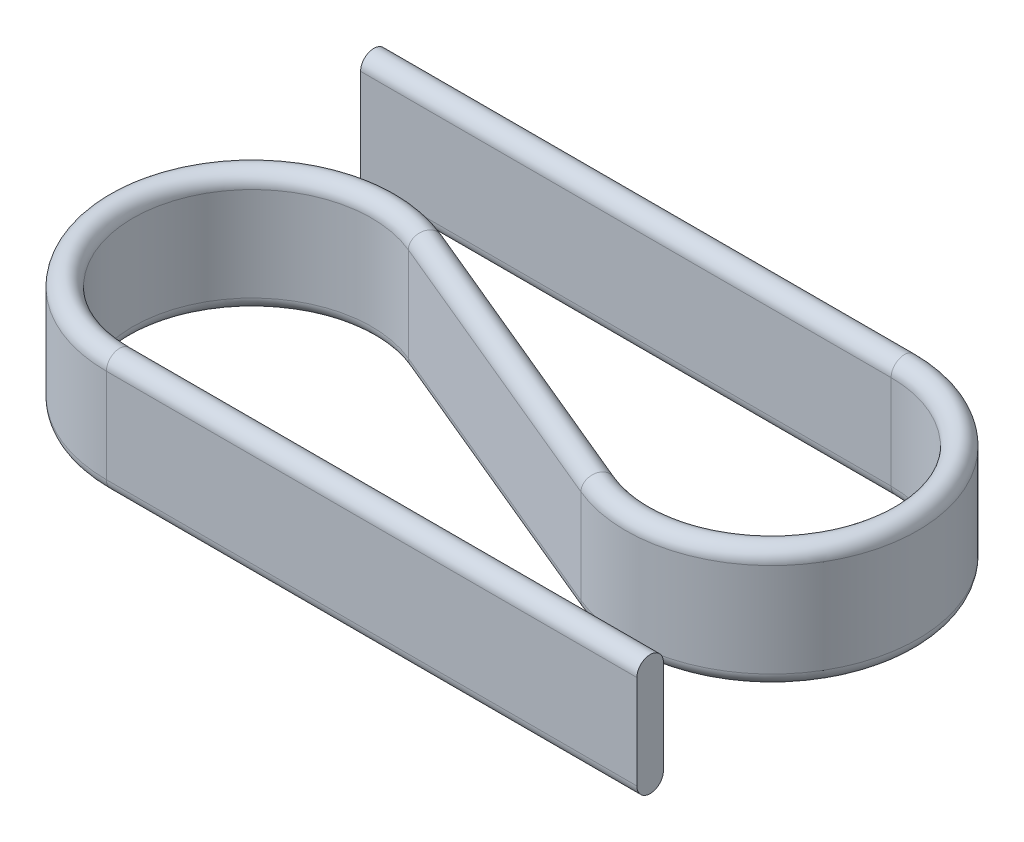
ISO-10303-21;
HEADER;
FILE_DESCRIPTION(('STEP AP214'),'2;1');
FILE_NAME('part.step','',(''),(''),'','','');
FILE_SCHEMA(('AUTOMOTIVE_DESIGN { 1 0 10303 214 1 1 1 1 }'));
ENDSEC;
DATA;
#1=APPLICATION_CONTEXT('core data for automotive mechanical design processes');
#2=APPLICATION_PROTOCOL_DEFINITION('international standard','automotive_design',2000,#1);
#3=PRODUCT_CONTEXT('',#1,'mechanical');
#4=PRODUCT('Part','Part','',(#3));
#5=PRODUCT_RELATED_PRODUCT_CATEGORY('part','',(#4));
#6=PRODUCT_DEFINITION_FORMATION('','',#4);
#7=PRODUCT_DEFINITION_CONTEXT('part definition',#1,'design');
#8=PRODUCT_DEFINITION('design','',#6,#7);
#9=PRODUCT_DEFINITION_SHAPE('','',#8);
#10=(LENGTH_UNIT() NAMED_UNIT(*) SI_UNIT(.MILLI.,.METRE.));
#11=(NAMED_UNIT(*) PLANE_ANGLE_UNIT() SI_UNIT($,.RADIAN.));
#12=(NAMED_UNIT(*) SI_UNIT($,.STERADIAN.) SOLID_ANGLE_UNIT());
#13=UNCERTAINTY_MEASURE_WITH_UNIT(LENGTH_MEASURE(1.E-05),#10,'distance_accuracy_value','');
#14=(GEOMETRIC_REPRESENTATION_CONTEXT(3) GLOBAL_UNCERTAINTY_ASSIGNED_CONTEXT((#13)) GLOBAL_UNIT_ASSIGNED_CONTEXT((#10,
#11,#12)) REPRESENTATION_CONTEXT('',''));
#15=CARTESIAN_POINT('',(0.,0.,0.));
#16=DIRECTION('',(0.,0.,1.));
#17=DIRECTION('',(1.,0.,0.));
#18=AXIS2_PLACEMENT_3D('',#15,#16,#17);
#19=CARTESIAN_POINT('',(0.,5.45,0.));
#20=DIRECTION('',(1.,0.,0.));
#21=DIRECTION('',(0.,0.,-1.));
#22=AXIS2_PLACEMENT_3D('',#19,#20,#21);
#23=CYLINDRICAL_SURFACE('',#22,1.2);
#24=CARTESIAN_POINT('',(48.,5.45,0.));
#25=DIRECTION('',(1.,0.,0.));
#26=DIRECTION('',(0.,0.,-1.));
#27=AXIS2_PLACEMENT_3D('',#24,#25,#26);
#28=CIRCLE('',#27,1.2);
#29=CARTESIAN_POINT('',(48.,5.45,-1.2));
#30=VERTEX_POINT('',#29);
#31=CARTESIAN_POINT('',(48.,5.45,1.2));
#32=VERTEX_POINT('',#31);
#33=EDGE_CURVE('E177',#30,#32,#28,.T.);
#34=ORIENTED_EDGE('',*,*,#33,.F.);
#35=DIRECTION('',(1.,0.,0.));
#36=VECTOR('',#35,1.);
#37=CARTESIAN_POINT('',(0.,5.45,-1.2));
#38=LINE('',#37,#36);
#39=CARTESIAN_POINT('',(0.,5.45,-1.2));
#40=VERTEX_POINT('',#39);
#41=EDGE_CURVE('E160',#40,#30,#38,.T.);
#42=ORIENTED_EDGE('',*,*,#41,.F.);
#43=CARTESIAN_POINT('',(0.,5.45,0.));
#44=DIRECTION('',(1.,0.,0.));
#45=DIRECTION('',(0.,0.,-1.));
#46=AXIS2_PLACEMENT_3D('',#43,#44,#45);
#47=CIRCLE('',#46,1.2);
#48=CARTESIAN_POINT('',(0.,5.45,1.2));
#49=VERTEX_POINT('',#48);
#50=EDGE_CURVE('E144',#40,#49,#47,.T.);
#51=ORIENTED_EDGE('',*,*,#50,.T.);
#52=DIRECTION('',(1.,0.,0.));
#53=VECTOR('',#52,1.);
#54=CARTESIAN_POINT('',(0.,5.45,1.2));
#55=LINE('',#54,#53);
#56=EDGE_CURVE('E158',#49,#32,#55,.T.);
#57=ORIENTED_EDGE('',*,*,#56,.T.);
#58=EDGE_LOOP('',(#34,#42,#51,#57));
#59=FACE_BOUND('',#58,.T.);
#60=ADVANCED_FACE('F34',(#59),#23,.T.);
#61=CARTESIAN_POINT('',(48.,5.45,12.));
#62=DIRECTION('',(0.,-1.,0.));
#63=DIRECTION('',(0.,0.,-1.));
#64=AXIS2_PLACEMENT_3D('',#61,#62,#63);
#65=TOROIDAL_SURFACE('',#64,12.,1.2);
#66=CARTESIAN_POINT('',(43.3846153846152,5.45,23.076923076923));
#67=DIRECTION('',(-0.923076923076918,0.,-0.384615384615398));
#68=DIRECTION('',(-0.384615384615398,0.,0.923076923076918));
#69=AXIS2_PLACEMENT_3D('',#66,#67,#68);
#70=CIRCLE('',#69,1.2);
#71=CARTESIAN_POINT('',(42.9230769230768,5.45,24.1846153846153));
#72=VERTEX_POINT('',#71);
#73=CARTESIAN_POINT('',(43.8461538461537,5.45,21.9692307692307));
#74=VERTEX_POINT('',#73);
#75=EDGE_CURVE('E185',#72,#74,#70,.T.);
#76=ORIENTED_EDGE('',*,*,#75,.F.);
#77=CARTESIAN_POINT('',(48.,5.45,12.));
#78=DIRECTION('',(0.,-1.,0.));
#79=DIRECTION('',(0.,0.,-1.));
#80=AXIS2_PLACEMENT_3D('',#77,#78,#79);
#81=CIRCLE('',#80,13.2);
#82=EDGE_CURVE('E211',#30,#72,#81,.T.);
#83=ORIENTED_EDGE('',*,*,#82,.F.);
#84=ORIENTED_EDGE('',*,*,#33,.T.);
#85=CARTESIAN_POINT('',(48.,5.45,12.));
#86=DIRECTION('',(0.,-1.,0.));
#87=DIRECTION('',(0.,0.,-1.));
#88=AXIS2_PLACEMENT_3D('',#85,#86,#87);
#89=CIRCLE('',#88,10.8);
#90=EDGE_CURVE('E174',#32,#74,#89,.T.);
#91=ORIENTED_EDGE('',*,*,#90,.T.);
#92=EDGE_LOOP('',(#76,#83,#84,#91));
#93=FACE_BOUND('',#92,.T.);
#94=ADVANCED_FACE('F284',(#93),#65,.T.);
#95=CARTESIAN_POINT('',(43.3846153846152,5.45,23.076923076923));
#96=DIRECTION('',(-0.923076923076918,0.,-0.384615384615397));
#97=DIRECTION('',(-0.384615384615397,0.,0.923076923076918));
#98=AXIS2_PLACEMENT_3D('',#95,#96,#97);
#99=CYLINDRICAL_SURFACE('',#98,1.2);
#100=CARTESIAN_POINT('',(16.6153846153846,5.45,11.9230769230765));
#101=DIRECTION('',(-0.923076923076918,0.,-0.384615384615397));
#102=DIRECTION('',(-0.384615384615397,0.,0.923076923076918));
#103=AXIS2_PLACEMENT_3D('',#100,#101,#102);
#104=CIRCLE('',#103,1.2);
#105=CARTESIAN_POINT('',(16.1538461538461,5.45,13.0307692307688));
#106=VERTEX_POINT('',#105);
#107=CARTESIAN_POINT('',(17.0769230769231,5.45,10.8153846153842));
#108=VERTEX_POINT('',#107);
#109=EDGE_CURVE('E192',#106,#108,#104,.T.);
#110=ORIENTED_EDGE('',*,*,#109,.F.);
#111=DIRECTION('',(-0.923076923076918,0.,-0.384615384615397));
#112=VECTOR('',#111,1.);
#113=CARTESIAN_POINT('',(42.9230769230767,5.45,24.1846153846153));
#114=LINE('',#113,#112);
#115=EDGE_CURVE('E217',#72,#106,#114,.T.);
#116=ORIENTED_EDGE('',*,*,#115,.F.);
#117=ORIENTED_EDGE('',*,*,#75,.T.);
#118=DIRECTION('',(-0.923076923076918,0.,-0.384615384615397));
#119=VECTOR('',#118,1.);
#120=CARTESIAN_POINT('',(43.8461538461537,5.45,21.9692307692307));
#121=LINE('',#120,#119);
#122=EDGE_CURVE('E182',#74,#108,#121,.T.);
#123=ORIENTED_EDGE('',*,*,#122,.T.);
#124=EDGE_LOOP('',(#110,#116,#117,#123));
#125=FACE_BOUND('',#124,.T.);
#126=ADVANCED_FACE('F305',(#125),#99,.T.);
#127=CARTESIAN_POINT('',(12.0000000000003,5.45,22.9999999999984));
#128=DIRECTION('',(0.,1.,0.));
#129=DIRECTION('',(0.,0.,1.));
#130=AXIS2_PLACEMENT_3D('',#127,#128,#129);
#131=TOROIDAL_SURFACE('',#130,11.9999999999988,1.2);
#132=CARTESIAN_POINT('',(12.0000000000003,5.45,34.9999999999971));
#133=DIRECTION('',(1.,0.,0.));
#134=DIRECTION('',(0.,0.,-1.));
#135=AXIS2_PLACEMENT_3D('',#132,#133,#134);
#136=CIRCLE('',#135,1.2);
#137=CARTESIAN_POINT('',(12.0000000000003,5.45,33.7999999999971));
#138=VERTEX_POINT('',#137);
#139=CARTESIAN_POINT('',(12.0000000000003,5.45,36.1999999999971));
#140=VERTEX_POINT('',#139);
#141=EDGE_CURVE('E199',#138,#140,#136,.T.);
#142=ORIENTED_EDGE('',*,*,#141,.F.);
#143=CARTESIAN_POINT('',(12.0000000000003,5.45,22.9999999999984));
#144=DIRECTION('',(0.,1.,0.));
#145=DIRECTION('',(0.384615384615397,0.,-0.923076923076918));
#146=AXIS2_PLACEMENT_3D('',#143,#144,#145);
#147=CIRCLE('',#146,10.7999999999988);
#148=EDGE_CURVE('E223',#106,#138,#147,.T.);
#149=ORIENTED_EDGE('',*,*,#148,.F.);
#150=ORIENTED_EDGE('',*,*,#109,.T.);
#151=CARTESIAN_POINT('',(12.0000000000003,5.45,22.9999999999984));
#152=DIRECTION('',(0.,1.,0.));
#153=DIRECTION('',(0.384615384615397,0.,-0.923076923076918));
#154=AXIS2_PLACEMENT_3D('',#151,#152,#153);
#155=CIRCLE('',#154,13.1999999999988);
#156=EDGE_CURVE('E189',#108,#140,#155,.T.);
#157=ORIENTED_EDGE('',*,*,#156,.T.);
#158=EDGE_LOOP('',(#142,#149,#150,#157));
#159=FACE_BOUND('',#158,.T.);
#160=ADVANCED_FACE('F302',(#159),#131,.T.);
#161=CARTESIAN_POINT('',(12.0000000000003,5.45,34.9999999999971));
#162=DIRECTION('',(1.,0.,0.));
#163=DIRECTION('',(0.,0.,-1.));
#164=AXIS2_PLACEMENT_3D('',#161,#162,#163);
#165=CYLINDRICAL_SURFACE('',#164,1.2);
#166=CARTESIAN_POINT('',(60.,5.45,34.9999999999971));
#167=DIRECTION('',(1.,0.,0.));
#168=DIRECTION('',(0.,0.,-1.));
#169=AXIS2_PLACEMENT_3D('',#166,#167,#168);
#170=CIRCLE('',#169,1.2);
#171=CARTESIAN_POINT('',(60.,5.45,33.7999999999971));
#172=VERTEX_POINT('',#171);
#173=CARTESIAN_POINT('',(60.,5.45,36.1999999999971));
#174=VERTEX_POINT('',#173);
#175=EDGE_CURVE('E234',#172,#174,#170,.T.);
#176=ORIENTED_EDGE('',*,*,#175,.F.);
#177=DIRECTION('',(1.,0.,0.));
#178=VECTOR('',#177,1.);
#179=CARTESIAN_POINT('',(12.0000000000003,5.45,33.7999999999971));
#180=LINE('',#179,#178);
#181=EDGE_CURVE('E228',#138,#172,#180,.T.);
#182=ORIENTED_EDGE('',*,*,#181,.F.);
#183=ORIENTED_EDGE('',*,*,#141,.T.);
#184=DIRECTION('',(1.,0.,0.));
#185=VECTOR('',#184,1.);
#186=CARTESIAN_POINT('',(12.0000000000003,5.45,36.1999999999971));
#187=LINE('',#186,#185);
#188=EDGE_CURVE('E196',#140,#174,#187,.T.);
#189=ORIENTED_EDGE('',*,*,#188,.T.);
#190=EDGE_LOOP('',(#176,#182,#183,#189));
#191=FACE_BOUND('',#190,.T.);
#192=ADVANCED_FACE('F299',(#191),#165,.T.);
#193=CARTESIAN_POINT('',(12.0000000000003,0.,33.8));
#194=DIRECTION('',(0.,0.,-1.));
#195=DIRECTION('',(0.,-1.,0.));
#196=AXIS2_PLACEMENT_3D('',#193,#194,#195);
#197=PLANE('',#196);
#198=DIRECTION('',(0.,1.,0.));
#199=VECTOR('',#198,1.);
#200=CARTESIAN_POINT('',(12.0000000000003,0.,33.8));
#201=LINE('',#200,#199);
#202=CARTESIAN_POINT('',(12.0000000000003,-3.05,33.7999999999971));
#203=VERTEX_POINT('',#202);
#204=EDGE_CURVE('E11',#203,#138,#201,.T.);
#205=ORIENTED_EDGE('',*,*,#204,.T.);
#206=ORIENTED_EDGE('',*,*,#181,.T.);
#207=DIRECTION('',(0.,1.,0.));
#208=VECTOR('',#207,1.);
#209=CARTESIAN_POINT('',(60.,0.,33.8));
#210=LINE('',#209,#208);
#211=CARTESIAN_POINT('',(60.,-3.05,33.7999999999971));
#212=VERTEX_POINT('',#211);
#213=EDGE_CURVE('E52',#212,#172,#210,.T.);
#214=ORIENTED_EDGE('',*,*,#213,.F.);
#215=DIRECTION('',(1.,0.,0.));
#216=VECTOR('',#215,1.);
#217=CARTESIAN_POINT('',(12.0000000000003,-3.05,33.7999999999971));
#218=LINE('',#217,#216);
#219=EDGE_CURVE('E225',#203,#212,#218,.T.);
#220=ORIENTED_EDGE('',*,*,#219,.F.);
#221=EDGE_LOOP('',(#205,#206,#214,#220));
#222=FACE_BOUND('',#221,.T.);
#223=ADVANCED_FACE('F318',(#222),#197,.T.);
#224=CARTESIAN_POINT('',(12.0000000000003,0.,36.2));
#225=DIRECTION('',(0.,0.,1.));
#226=DIRECTION('',(1.,0.,0.));
#227=AXIS2_PLACEMENT_3D('',#224,#225,#226);
#228=PLANE('',#227);
#229=DIRECTION('',(0.,-1.,0.));
#230=VECTOR('',#229,1.);
#231=CARTESIAN_POINT('',(12.0000000000003,0.,36.2));
#232=LINE('',#231,#230);
#233=CARTESIAN_POINT('',(12.0000000000003,-3.05,36.1999999999971));
#234=VERTEX_POINT('',#233);
#235=EDGE_CURVE('E44',#140,#234,#232,.T.);
#236=ORIENTED_EDGE('',*,*,#235,.T.);
#237=DIRECTION('',(1.,0.,0.));
#238=VECTOR('',#237,1.);
#239=CARTESIAN_POINT('',(12.0000000000003,-3.05,36.1999999999971));
#240=LINE('',#239,#238);
#241=CARTESIAN_POINT('',(60.,-3.05,36.1999999999971));
#242=VERTEX_POINT('',#241);
#243=EDGE_CURVE('E193',#234,#242,#240,.T.);
#244=ORIENTED_EDGE('',*,*,#243,.T.);
#245=DIRECTION('',(0.,-1.,0.));
#246=VECTOR('',#245,1.);
#247=CARTESIAN_POINT('',(60.,0.,36.2));
#248=LINE('',#247,#246);
#249=EDGE_CURVE('E245',#174,#242,#248,.T.);
#250=ORIENTED_EDGE('',*,*,#249,.F.);
#251=ORIENTED_EDGE('',*,*,#188,.F.);
#252=EDGE_LOOP('',(#236,#244,#250,#251));
#253=FACE_BOUND('',#252,.T.);
#254=ADVANCED_FACE('F296',(#253),#228,.T.);
#255=CARTESIAN_POINT('',(12.,0.,23.));
#256=DIRECTION('',(0.,1.,0.));
#257=DIRECTION('',(0.,0.,1.));
#258=AXIS2_PLACEMENT_3D('',#255,#256,#257);
#259=CYLINDRICAL_SURFACE('',#258,10.8);
#260=DIRECTION('',(0.,1.,0.));
#261=VECTOR('',#260,1.);
#262=CARTESIAN_POINT('',(16.153846153846,0.,13.0307692307691));
#263=LINE('',#262,#261);
#264=CARTESIAN_POINT('',(16.1538461538461,-3.05,13.0307692307688));
#265=VERTEX_POINT('',#264);
#266=EDGE_CURVE('E38',#265,#106,#263,.T.);
#267=ORIENTED_EDGE('',*,*,#266,.T.);
#268=ORIENTED_EDGE('',*,*,#148,.T.);
#269=ORIENTED_EDGE('',*,*,#204,.F.);
#270=CARTESIAN_POINT('',(12.0000000000003,-3.05,22.9999999999984));
#271=DIRECTION('',(0.,1.,0.));
#272=DIRECTION('',(0.384615384615397,0.,-0.923076923076918));
#273=AXIS2_PLACEMENT_3D('',#270,#271,#272);
#274=CIRCLE('',#273,10.7999999999988);
#275=EDGE_CURVE('E220',#265,#203,#274,.T.);
#276=ORIENTED_EDGE('',*,*,#275,.F.);
#277=EDGE_LOOP('',(#267,#268,#269,#276));
#278=FACE_BOUND('',#277,.T.);
#279=ADVANCED_FACE('F333',(#278),#259,.F.);
#280=CARTESIAN_POINT('',(12.,0.,23.));
#281=DIRECTION('',(0.,1.,0.));
#282=DIRECTION('',(0.,0.,1.));
#283=AXIS2_PLACEMENT_3D('',#280,#281,#282);
#284=CYLINDRICAL_SURFACE('',#283,13.2);
#285=DIRECTION('',(0.,-1.,0.));
#286=VECTOR('',#285,1.);
#287=CARTESIAN_POINT('',(17.0769230769229,0.,10.8153846153845));
#288=LINE('',#287,#286);
#289=CARTESIAN_POINT('',(17.0769230769231,-3.05,10.8153846153842));
#290=VERTEX_POINT('',#289);
#291=EDGE_CURVE('E122',#108,#290,#288,.T.);
#292=ORIENTED_EDGE('',*,*,#291,.T.);
#293=CARTESIAN_POINT('',(12.0000000000003,-3.05,22.9999999999984));
#294=DIRECTION('',(0.,1.,0.));
#295=DIRECTION('',(0.384615384615397,0.,-0.923076923076918));
#296=AXIS2_PLACEMENT_3D('',#293,#294,#295);
#297=CIRCLE('',#296,13.1999999999988);
#298=EDGE_CURVE('E186',#290,#234,#297,.T.);
#299=ORIENTED_EDGE('',*,*,#298,.T.);
#300=ORIENTED_EDGE('',*,*,#235,.F.);
#301=ORIENTED_EDGE('',*,*,#156,.F.);
#302=EDGE_LOOP('',(#292,#299,#300,#301));
#303=FACE_BOUND('',#302,.T.);
#304=ADVANCED_FACE('F295',(#303),#284,.T.);
#305=CARTESIAN_POINT('',(42.9230769230767,0.,24.1846153846153));
#306=DIRECTION('',(-0.384615384615385,0.,0.923076923076923));
#307=DIRECTION('',(0.,1.,0.));
#308=AXIS2_PLACEMENT_3D('',#305,#306,#307);
#309=PLANE('',#308);
#310=DIRECTION('',(0.,1.,0.));
#311=VECTOR('',#310,1.);
#312=CARTESIAN_POINT('',(42.9230769230767,0.,24.1846153846153));
#313=LINE('',#312,#311);
#314=CARTESIAN_POINT('',(42.9230769230768,-3.05,24.1846153846153));
#315=VERTEX_POINT('',#314);
#316=EDGE_CURVE('E253',#315,#72,#313,.T.);
#317=ORIENTED_EDGE('',*,*,#316,.T.);
#318=ORIENTED_EDGE('',*,*,#115,.T.);
#319=ORIENTED_EDGE('',*,*,#266,.F.);
#320=DIRECTION('',(-0.923076923076918,0.,-0.384615384615397));
#321=VECTOR('',#320,1.);
#322=CARTESIAN_POINT('',(42.9230769230767,-3.05,24.1846153846153));
#323=LINE('',#322,#321);
#324=EDGE_CURVE('E214',#315,#265,#323,.T.);
#325=ORIENTED_EDGE('',*,*,#324,.F.);
#326=EDGE_LOOP('',(#317,#318,#319,#325));
#327=FACE_BOUND('',#326,.T.);
#328=ADVANCED_FACE('F287',(#327),#309,.T.);
#329=CARTESIAN_POINT('',(43.8461538461537,0.,21.9692307692307));
#330=DIRECTION('',(0.384615384615385,0.,-0.923076923076923));
#331=DIRECTION('',(0.,-1.,0.));
#332=AXIS2_PLACEMENT_3D('',#329,#330,#331);
#333=PLANE('',#332);
#334=DIRECTION('',(0.,-1.,0.));
#335=VECTOR('',#334,1.);
#336=CARTESIAN_POINT('',(43.8461538461537,0.,21.9692307692307));
#337=LINE('',#336,#335);
#338=CARTESIAN_POINT('',(43.8461538461537,-3.05,21.9692307692307));
#339=VERTEX_POINT('',#338);
#340=EDGE_CURVE('E256',#74,#339,#337,.T.);
#341=ORIENTED_EDGE('',*,*,#340,.T.);
#342=DIRECTION('',(-0.923076923076918,0.,-0.384615384615397));
#343=VECTOR('',#342,1.);
#344=CARTESIAN_POINT('',(43.8461538461537,-3.05,21.9692307692307));
#345=LINE('',#344,#343);
#346=EDGE_CURVE('E178',#339,#290,#345,.T.);
#347=ORIENTED_EDGE('',*,*,#346,.T.);
#348=ORIENTED_EDGE('',*,*,#291,.F.);
#349=ORIENTED_EDGE('',*,*,#122,.F.);
#350=EDGE_LOOP('',(#341,#347,#348,#349));
#351=FACE_BOUND('',#350,.T.);
#352=ADVANCED_FACE('F307',(#351),#333,.T.);
#353=CARTESIAN_POINT('',(48.,0.,12.));
#354=DIRECTION('',(0.,-1.,0.));
#355=DIRECTION('',(0.,0.,-1.));
#356=AXIS2_PLACEMENT_3D('',#353,#354,#355);
#357=CYLINDRICAL_SURFACE('',#356,13.2);
#358=DIRECTION('',(0.,1.,0.));
#359=VECTOR('',#358,1.);
#360=CARTESIAN_POINT('',(48.,0.,-1.2));
#361=LINE('',#360,#359);
#362=CARTESIAN_POINT('',(48.,-3.05,-1.2));
#363=VERTEX_POINT('',#362);
#364=EDGE_CURVE('E250',#363,#30,#361,.T.);
#365=ORIENTED_EDGE('',*,*,#364,.T.);
#366=ORIENTED_EDGE('',*,*,#82,.T.);
#367=ORIENTED_EDGE('',*,*,#316,.F.);
#368=CARTESIAN_POINT('',(48.,-3.05,12.));
#369=DIRECTION('',(0.,-1.,0.));
#370=DIRECTION('',(0.,0.,-1.));
#371=AXIS2_PLACEMENT_3D('',#368,#369,#370);
#372=CIRCLE('',#371,13.2);
#373=EDGE_CURVE('E208',#363,#315,#372,.T.);
#374=ORIENTED_EDGE('',*,*,#373,.F.);
#375=EDGE_LOOP('',(#365,#366,#367,#374));
#376=FACE_BOUND('',#375,.T.);
#377=ADVANCED_FACE('F36',(#376),#357,.T.);
#378=CARTESIAN_POINT('',(48.,0.,12.));
#379=DIRECTION('',(0.,-1.,0.));
#380=DIRECTION('',(0.,0.,-1.));
#381=AXIS2_PLACEMENT_3D('',#378,#379,#380);
#382=CYLINDRICAL_SURFACE('',#381,10.8);
#383=DIRECTION('',(0.,-1.,0.));
#384=VECTOR('',#383,1.);
#385=CARTESIAN_POINT('',(48.,0.,1.2));
#386=LINE('',#385,#384);
#387=CARTESIAN_POINT('',(48.,-3.05,1.2));
#388=VERTEX_POINT('',#387);
#389=EDGE_CURVE('E163',#32,#388,#386,.T.);
#390=ORIENTED_EDGE('',*,*,#389,.T.);
#391=CARTESIAN_POINT('',(48.,-3.05,12.));
#392=DIRECTION('',(0.,-1.,0.));
#393=DIRECTION('',(0.,0.,-1.));
#394=AXIS2_PLACEMENT_3D('',#391,#392,#393);
#395=CIRCLE('',#394,10.8);
#396=EDGE_CURVE('E170',#388,#339,#395,.T.);
#397=ORIENTED_EDGE('',*,*,#396,.T.);
#398=ORIENTED_EDGE('',*,*,#340,.F.);
#399=ORIENTED_EDGE('',*,*,#90,.F.);
#400=EDGE_LOOP('',(#390,#397,#398,#399));
#401=FACE_BOUND('',#400,.T.);
#402=ADVANCED_FACE('F279',(#401),#382,.F.);
#403=CARTESIAN_POINT('',(48.,0.,-1.2));
#404=DIRECTION('',(0.,0.,1.));
#405=DIRECTION('',(1.,0.,0.));
#406=AXIS2_PLACEMENT_3D('',#403,#404,#405);
#407=PLANE('',#406);
#408=DIRECTION('',(0.,1.,0.));
#409=VECTOR('',#408,1.);
#410=CARTESIAN_POINT('',(0.,0.,-1.2));
#411=LINE('',#410,#409);
#412=CARTESIAN_POINT('',(0.,-3.05,-1.2));
#413=VERTEX_POINT('',#412);
#414=EDGE_CURVE('E153',#413,#40,#411,.T.);
#415=ORIENTED_EDGE('',*,*,#414,.T.);
#416=ORIENTED_EDGE('',*,*,#41,.T.);
#417=ORIENTED_EDGE('',*,*,#364,.F.);
#418=DIRECTION('',(1.,0.,0.));
#419=VECTOR('',#418,1.);
#420=CARTESIAN_POINT('',(0.,-3.05,-1.2));
#421=LINE('',#420,#419);
#422=EDGE_CURVE('E203',#413,#363,#421,.T.);
#423=ORIENTED_EDGE('',*,*,#422,.F.);
#424=EDGE_LOOP('',(#415,#416,#417,#423));
#425=FACE_BOUND('',#424,.T.);
#426=ADVANCED_FACE('F269',(#425),#407,.F.);
#427=CARTESIAN_POINT('',(48.,0.,1.2));
#428=DIRECTION('',(0.,0.,-1.));
#429=DIRECTION('',(0.,-1.,0.));
#430=AXIS2_PLACEMENT_3D('',#427,#428,#429);
#431=PLANE('',#430);
#432=DIRECTION('',(0.,-1.,0.));
#433=VECTOR('',#432,1.);
#434=CARTESIAN_POINT('',(0.,0.,1.2));
#435=LINE('',#434,#433);
#436=CARTESIAN_POINT('',(0.,-3.05,1.2));
#437=VERTEX_POINT('',#436);
#438=EDGE_CURVE('E141',#49,#437,#435,.T.);
#439=ORIENTED_EDGE('',*,*,#438,.T.);
#440=DIRECTION('',(1.,0.,0.));
#441=VECTOR('',#440,1.);
#442=CARTESIAN_POINT('',(0.,-3.05,1.2));
#443=LINE('',#442,#441);
#444=EDGE_CURVE('E165',#437,#388,#443,.T.);
#445=ORIENTED_EDGE('',*,*,#444,.T.);
#446=ORIENTED_EDGE('',*,*,#389,.F.);
#447=ORIENTED_EDGE('',*,*,#56,.F.);
#448=EDGE_LOOP('',(#439,#445,#446,#447));
#449=FACE_BOUND('',#448,.T.);
#450=ADVANCED_FACE('F162',(#449),#431,.F.);
#451=CARTESIAN_POINT('',(60.,0.,35.));
#452=DIRECTION('',(1.,0.,0.));
#453=DIRECTION('',(0.,0.,1.));
#454=AXIS2_PLACEMENT_3D('',#451,#452,#453);
#455=PLANE('',#454);
#456=ORIENTED_EDGE('',*,*,#249,.T.);
#457=CARTESIAN_POINT('',(60.,-3.05,34.9999999999971));
#458=DIRECTION('',(1.,0.,0.));
#459=DIRECTION('',(0.,0.,-1.));
#460=AXIS2_PLACEMENT_3D('',#457,#458,#459);
#461=CIRCLE('',#460,1.2);
#462=EDGE_CURVE('E195',#242,#212,#461,.T.);
#463=ORIENTED_EDGE('',*,*,#462,.T.);
#464=ORIENTED_EDGE('',*,*,#213,.T.);
#465=ORIENTED_EDGE('',*,*,#175,.T.);
#466=EDGE_LOOP('',(#456,#463,#464,#465));
#467=FACE_BOUND('',#466,.T.);
#468=ADVANCED_FACE('F330',(#467),#455,.T.);
#469=CARTESIAN_POINT('',(0.,0.,0.));
#470=DIRECTION('',(1.,0.,0.));
#471=DIRECTION('',(0.,1.,0.));
#472=AXIS2_PLACEMENT_3D('',#469,#470,#471);
#473=PLANE('',#472);
#474=ORIENTED_EDGE('',*,*,#414,.F.);
#475=CARTESIAN_POINT('',(0.,-3.05,0.));
#476=DIRECTION('',(1.,0.,0.));
#477=DIRECTION('',(0.,0.,-1.));
#478=AXIS2_PLACEMENT_3D('',#475,#476,#477);
#479=CIRCLE('',#478,1.2);
#480=EDGE_CURVE('E147',#437,#413,#479,.T.);
#481=ORIENTED_EDGE('',*,*,#480,.F.);
#482=ORIENTED_EDGE('',*,*,#438,.F.);
#483=ORIENTED_EDGE('',*,*,#50,.F.);
#484=EDGE_LOOP('',(#474,#481,#482,#483));
#485=FACE_BOUND('',#484,.T.);
#486=ADVANCED_FACE('F143',(#485),#473,.F.);
#487=CARTESIAN_POINT('',(12.0000000000003,-3.05,34.9999999999971));
#488=DIRECTION('',(1.,0.,0.));
#489=DIRECTION('',(0.,0.,-1.));
#490=AXIS2_PLACEMENT_3D('',#487,#488,#489);
#491=CYLINDRICAL_SURFACE('',#490,1.2);
#492=ORIENTED_EDGE('',*,*,#219,.T.);
#493=ORIENTED_EDGE('',*,*,#462,.F.);
#494=ORIENTED_EDGE('',*,*,#243,.F.);
#495=CARTESIAN_POINT('',(12.0000000000003,-3.05,34.9999999999971));
#496=DIRECTION('',(1.,0.,0.));
#497=DIRECTION('',(0.,0.,-1.));
#498=AXIS2_PLACEMENT_3D('',#495,#496,#497);
#499=CIRCLE('',#498,1.2);
#500=EDGE_CURVE('E188',#234,#203,#499,.T.);
#501=ORIENTED_EDGE('',*,*,#500,.T.);
#502=EDGE_LOOP('',(#492,#493,#494,#501));
#503=FACE_BOUND('',#502,.T.);
#504=ADVANCED_FACE('F335',(#503),#491,.T.);
#505=CARTESIAN_POINT('',(12.0000000000003,-3.05,22.9999999999984));
#506=DIRECTION('',(0.,1.,0.));
#507=DIRECTION('',(0.,0.,1.));
#508=AXIS2_PLACEMENT_3D('',#505,#506,#507);
#509=TOROIDAL_SURFACE('',#508,11.9999999999988,1.2);
#510=ORIENTED_EDGE('',*,*,#275,.T.);
#511=ORIENTED_EDGE('',*,*,#500,.F.);
#512=ORIENTED_EDGE('',*,*,#298,.F.);
#513=CARTESIAN_POINT('',(16.6153846153846,-3.05,11.9230769230765));
#514=DIRECTION('',(-0.923076923076918,0.,-0.384615384615397));
#515=DIRECTION('',(-0.384615384615397,0.,0.923076923076918));
#516=AXIS2_PLACEMENT_3D('',#513,#514,#515);
#517=CIRCLE('',#516,1.2);
#518=EDGE_CURVE('E181',#290,#265,#517,.T.);
#519=ORIENTED_EDGE('',*,*,#518,.T.);
#520=EDGE_LOOP('',(#510,#511,#512,#519));
#521=FACE_BOUND('',#520,.T.);
#522=ADVANCED_FACE('F293',(#521),#509,.T.);
#523=CARTESIAN_POINT('',(43.3846153846152,-3.05,23.076923076923));
#524=DIRECTION('',(-0.923076923076918,0.,-0.384615384615397));
#525=DIRECTION('',(-0.384615384615397,0.,0.923076923076918));
#526=AXIS2_PLACEMENT_3D('',#523,#524,#525);
#527=CYLINDRICAL_SURFACE('',#526,1.2);
#528=ORIENTED_EDGE('',*,*,#324,.T.);
#529=ORIENTED_EDGE('',*,*,#518,.F.);
#530=ORIENTED_EDGE('',*,*,#346,.F.);
#531=CARTESIAN_POINT('',(43.3846153846152,-3.05,23.076923076923));
#532=DIRECTION('',(-0.923076923076918,0.,-0.384615384615398));
#533=DIRECTION('',(-0.384615384615398,0.,0.923076923076918));
#534=AXIS2_PLACEMENT_3D('',#531,#532,#533);
#535=CIRCLE('',#534,1.2);
#536=EDGE_CURVE('E173',#339,#315,#535,.T.);
#537=ORIENTED_EDGE('',*,*,#536,.T.);
#538=EDGE_LOOP('',(#528,#529,#530,#537));
#539=FACE_BOUND('',#538,.T.);
#540=ADVANCED_FACE('F290',(#539),#527,.T.);
#541=CARTESIAN_POINT('',(48.,-3.05,12.));
#542=DIRECTION('',(0.,-1.,0.));
#543=DIRECTION('',(0.,0.,-1.));
#544=AXIS2_PLACEMENT_3D('',#541,#542,#543);
#545=TOROIDAL_SURFACE('',#544,12.,1.2);
#546=ORIENTED_EDGE('',*,*,#373,.T.);
#547=ORIENTED_EDGE('',*,*,#536,.F.);
#548=ORIENTED_EDGE('',*,*,#396,.F.);
#549=CARTESIAN_POINT('',(48.,-3.05,0.));
#550=DIRECTION('',(1.,0.,0.));
#551=DIRECTION('',(0.,0.,-1.));
#552=AXIS2_PLACEMENT_3D('',#549,#550,#551);
#553=CIRCLE('',#552,1.2);
#554=EDGE_CURVE('E167',#388,#363,#553,.T.);
#555=ORIENTED_EDGE('',*,*,#554,.T.);
#556=EDGE_LOOP('',(#546,#547,#548,#555));
#557=FACE_BOUND('',#556,.T.);
#558=ADVANCED_FACE('F275',(#557),#545,.T.);
#559=CARTESIAN_POINT('',(0.,-3.05,0.));
#560=DIRECTION('',(1.,0.,0.));
#561=DIRECTION('',(0.,0.,-1.));
#562=AXIS2_PLACEMENT_3D('',#559,#560,#561);
#563=CYLINDRICAL_SURFACE('',#562,1.2);
#564=ORIENTED_EDGE('',*,*,#422,.T.);
#565=ORIENTED_EDGE('',*,*,#554,.F.);
#566=ORIENTED_EDGE('',*,*,#444,.F.);
#567=ORIENTED_EDGE('',*,*,#480,.T.);
#568=EDGE_LOOP('',(#564,#565,#566,#567));
#569=FACE_BOUND('',#568,.T.);
#570=ADVANCED_FACE('F271',(#569),#563,.T.);
#571=CLOSED_SHELL('',(#60,#94,#126,#160,#192,#223,#254,#279,#304,#328,#352,#377,#402,#426,#450,
#468,#486,#504,#522,#540,#558,#570));
#572=MANIFOLD_SOLID_BREP('B2',#571);
#573=ADVANCED_BREP_SHAPE_REPRESENTATION('',(#18,#572),#14);
#574=SHAPE_DEFINITION_REPRESENTATION(#9,#573);
ENDSEC;
END-ISO-10303-21;
